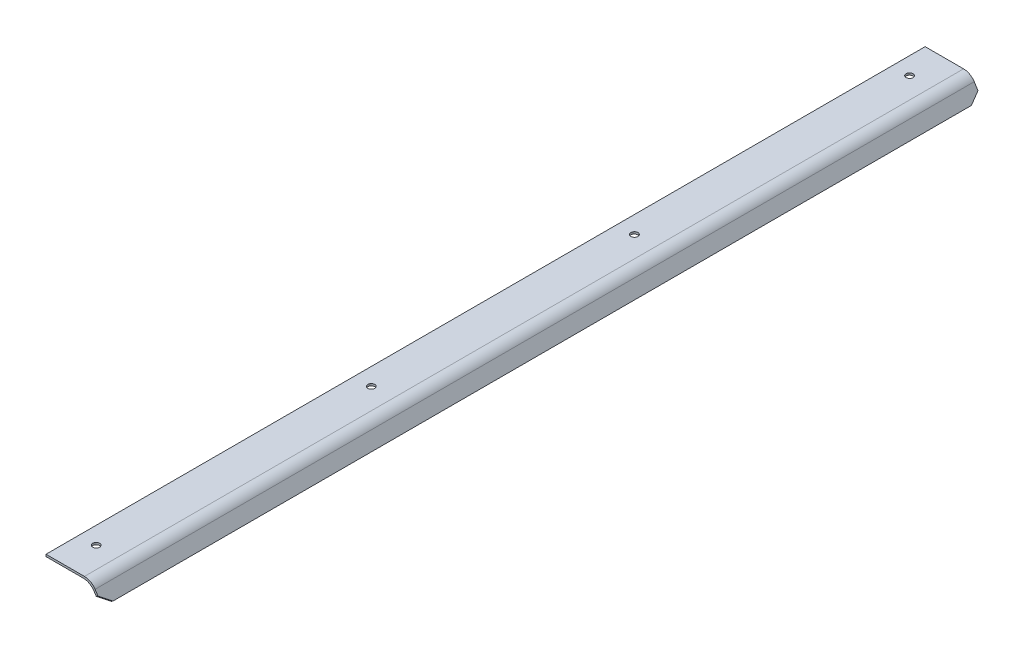
ISO-10303-21;
HEADER;
FILE_DESCRIPTION(('STEP AP214'),'2;1');
FILE_NAME('part.step','',(''),(''),'','','');
FILE_SCHEMA(('AUTOMOTIVE_DESIGN { 1 0 10303 214 1 1 1 1 }'));
ENDSEC;
DATA;
#1=APPLICATION_CONTEXT('core data for automotive mechanical design processes');
#2=APPLICATION_PROTOCOL_DEFINITION('international standard','automotive_design',2000,#1);
#3=PRODUCT_CONTEXT('',#1,'mechanical');
#4=PRODUCT('Part','Part','',(#3));
#5=PRODUCT_RELATED_PRODUCT_CATEGORY('part','',(#4));
#6=PRODUCT_DEFINITION_FORMATION('','',#4);
#7=PRODUCT_DEFINITION_CONTEXT('part definition',#1,'design');
#8=PRODUCT_DEFINITION('design','',#6,#7);
#9=PRODUCT_DEFINITION_SHAPE('','',#8);
#10=(LENGTH_UNIT() NAMED_UNIT(*) SI_UNIT(.MILLI.,.METRE.));
#11=(NAMED_UNIT(*) PLANE_ANGLE_UNIT() SI_UNIT($,.RADIAN.));
#12=(NAMED_UNIT(*) SI_UNIT($,.STERADIAN.) SOLID_ANGLE_UNIT());
#13=UNCERTAINTY_MEASURE_WITH_UNIT(LENGTH_MEASURE(1.E-05),#10,'distance_accuracy_value','');
#14=(GEOMETRIC_REPRESENTATION_CONTEXT(3) GLOBAL_UNCERTAINTY_ASSIGNED_CONTEXT((#13)) GLOBAL_UNIT_ASSIGNED_CONTEXT((#10,
#11,#12)) REPRESENTATION_CONTEXT('',''));
#15=CARTESIAN_POINT('',(0.,0.,0.));
#16=DIRECTION('',(0.,0.,1.));
#17=DIRECTION('',(1.,0.,0.));
#18=AXIS2_PLACEMENT_3D('',#15,#16,#17);
#19=CARTESIAN_POINT('',(30.5402033473676,-6.72031508959953,-254.));
#20=DIRECTION('',(-0.451408434082913,0.698955018543043,0.554700196225229));
#21=DIRECTION('',(0.,-0.621639976101332,0.783303095942264));
#22=AXIS2_PLACEMENT_3D('',#19,#20,#21);
#23=PLANE('',#22);
#24=DIRECTION('',(0.840039386199942,0.542525418420947,0.));
#25=VECTOR('',#24,1.);
#26=CARTESIAN_POINT('',(32.7103050210514,-10.0804726343993,-248.));
#27=LINE('',#26,#25);
#28=CARTESIAN_POINT('',(31.7022577576114,-10.7315031365044,-248.));
#29=VERTEX_POINT('',#28);
#30=CARTESIAN_POINT('',(32.7103050210514,-10.0804726343992,-248.));
#31=VERTEX_POINT('',#30);
#32=EDGE_CURVE('E171',#29,#31,#27,.T.);
#33=ORIENTED_EDGE('',*,*,#32,.F.);
#34=DIRECTION('',(0.300938956055274,-0.465970012362026,0.832050294337846));
#35=VECTOR('',#34,1.);
#36=CARTESIAN_POINT('',(29.5321560839277,-7.37134559170467,-254.));
#37=LINE('',#36,#35);
#38=CARTESIAN_POINT('',(29.5321560839277,-7.37134559170469,-254.));
#39=VERTEX_POINT('',#38);
#40=EDGE_CURVE('E140',#39,#29,#37,.T.);
#41=ORIENTED_EDGE('',*,*,#40,.F.);
#42=DIRECTION('',(-0.840039386199941,-0.542525418420949,0.));
#43=VECTOR('',#42,1.);
#44=CARTESIAN_POINT('',(30.5402033473676,-6.72031508959953,-254.));
#45=LINE('',#44,#43);
#46=CARTESIAN_POINT('',(30.5402033473676,-6.72031508959955,-254.));
#47=VERTEX_POINT('',#46);
#48=EDGE_CURVE('E179',#47,#39,#45,.T.);
#49=ORIENTED_EDGE('',*,*,#48,.F.);
#50=DIRECTION('',(-0.300938956055274,0.465970012362026,-0.832050294337845));
#51=VECTOR('',#50,1.);
#52=CARTESIAN_POINT('',(32.7103050210514,-10.0804726343993,-248.));
#53=LINE('',#52,#51);
#54=EDGE_CURVE('E152',#31,#47,#53,.T.);
#55=ORIENTED_EDGE('',*,*,#54,.F.);
#56=EDGE_LOOP('',(#33,#41,#49,#55));
#57=FACE_BOUND('',#56,.T.);
#58=ADVANCED_FACE('F15',(#57),#23,.F.);
#59=CARTESIAN_POINT('',(32.7103050210514,-10.0804726343993,0.));
#60=DIRECTION('',(0.542525418420947,-0.840039386199942,0.));
#61=DIRECTION('',(0.840039386199942,0.542525418420947,0.));
#62=AXIS2_PLACEMENT_3D('',#59,#60,#61);
#63=PLANE('',#62);
#64=DIRECTION('',(-0.840039386199941,-0.54252541842095,0.));
#65=VECTOR('',#64,1.);
#66=CARTESIAN_POINT('',(32.7103050210514,-10.0804726343993,248.));
#67=LINE('',#66,#65);
#68=CARTESIAN_POINT('',(32.7103050210514,-10.0804726343993,248.));
#69=VERTEX_POINT('',#68);
#70=CARTESIAN_POINT('',(31.7022577576115,-10.7315031365044,248.));
#71=VERTEX_POINT('',#70);
#72=EDGE_CURVE('E167',#69,#71,#67,.T.);
#73=ORIENTED_EDGE('',*,*,#72,.T.);
#74=DIRECTION('',(0.,0.,1.));
#75=VECTOR('',#74,1.);
#76=CARTESIAN_POINT('',(31.7022577576115,-10.7315031365044,0.));
#77=LINE('',#76,#75);
#78=EDGE_CURVE('E143',#29,#71,#77,.T.);
#79=ORIENTED_EDGE('',*,*,#78,.F.);
#80=ORIENTED_EDGE('',*,*,#32,.T.);
#81=DIRECTION('',(0.,0.,1.));
#82=VECTOR('',#81,1.);
#83=CARTESIAN_POINT('',(32.7103050210514,-10.0804726343993,0.));
#84=LINE('',#83,#82);
#85=EDGE_CURVE('E144',#69,#31,#84,.F.);
#86=ORIENTED_EDGE('',*,*,#85,.F.);
#87=EDGE_LOOP('',(#73,#79,#80,#86));
#88=FACE_BOUND('',#87,.T.);
#89=ADVANCED_FACE('F264',(#88),#63,.T.);
#90=CARTESIAN_POINT('',(32.7103050210514,-10.0804726343993,248.));
#91=DIRECTION('',(-0.418818268964526,0.648492825671256,-0.63564794708586));
#92=DIRECTION('',(0.,0.699998784175362,0.714144034598774));
#93=AXIS2_PLACEMENT_3D('',#90,#91,#92);
#94=PLANE('',#93);
#95=DIRECTION('',(0.840039386199941,0.54252541842095,0.));
#96=VECTOR('',#95,1.);
#97=CARTESIAN_POINT('',(29.0219635809521,-6.58137007628866,254.));
#98=LINE('',#97,#96);
#99=CARTESIAN_POINT('',(29.0219635809522,-6.58137007628869,254.));
#100=VERTEX_POINT('',#99);
#101=CARTESIAN_POINT('',(30.0300108443921,-5.93033957418356,254.));
#102=VERTEX_POINT('',#101);
#103=EDGE_CURVE('E156',#100,#102,#98,.T.);
#104=ORIENTED_EDGE('',*,*,#103,.F.);
#105=DIRECTION('',(-0.344855168461172,0.533969311309256,0.771979071844267));
#106=VECTOR('',#105,1.);
#107=CARTESIAN_POINT('',(31.7022577576115,-10.7315031365044,248.));
#108=LINE('',#107,#106);
#109=EDGE_CURVE('E104',#71,#100,#108,.T.);
#110=ORIENTED_EDGE('',*,*,#109,.F.);
#111=ORIENTED_EDGE('',*,*,#72,.F.);
#112=DIRECTION('',(0.344855168461172,-0.533969311309256,-0.771979071844267));
#113=VECTOR('',#112,1.);
#114=CARTESIAN_POINT('',(30.0300108443921,-5.93033957418355,254.));
#115=LINE('',#114,#113);
#116=EDGE_CURVE('E155',#102,#69,#115,.T.);
#117=ORIENTED_EDGE('',*,*,#116,.F.);
#118=EDGE_LOOP('',(#104,#110,#111,#117));
#119=FACE_BOUND('',#118,.T.);
#120=ADVANCED_FACE('F266',(#119),#94,.F.);
#121=CARTESIAN_POINT('',(28.3701016736838,-3.36015754479977,0.));
#122=DIRECTION('',(0.840039386199941,0.542525418420949,0.));
#123=DIRECTION('',(-0.542525418420949,0.840039386199941,0.));
#124=AXIS2_PLACEMENT_3D('',#121,#122,#123);
#125=PLANE('',#124);
#126=ORIENTED_EDGE('',*,*,#116,.T.);
#127=ORIENTED_EDGE('',*,*,#85,.T.);
#128=ORIENTED_EDGE('',*,*,#54,.T.);
#129=DIRECTION('',(-0.542525418420949,0.840039386199941,0.));
#130=VECTOR('',#129,1.);
#131=CARTESIAN_POINT('',(30.5402033473676,-6.72031508959953,-254.));
#132=LINE('',#131,#130);
#133=CARTESIAN_POINT('',(28.3701016736838,-3.36015754479977,-254.));
#134=VERTEX_POINT('',#133);
#135=EDGE_CURVE('E151',#47,#134,#132,.T.);
#136=ORIENTED_EDGE('',*,*,#135,.T.);
#137=DIRECTION('',(0.,0.,1.));
#138=VECTOR('',#137,1.);
#139=CARTESIAN_POINT('',(28.3701016736838,-3.36015754479977,0.));
#140=LINE('',#139,#138);
#141=CARTESIAN_POINT('',(28.3701016736838,-3.36015754479977,254.));
#142=VERTEX_POINT('',#141);
#143=EDGE_CURVE('E148',#142,#134,#140,.F.);
#144=ORIENTED_EDGE('',*,*,#143,.F.);
#145=DIRECTION('',(-0.542525418420949,0.840039386199941,0.));
#146=VECTOR('',#145,1.);
#147=CARTESIAN_POINT('',(30.0300108443921,-5.93033957418355,254.));
#148=LINE('',#147,#146);
#149=EDGE_CURVE('E118',#102,#142,#148,.T.);
#150=ORIENTED_EDGE('',*,*,#149,.F.);
#151=EDGE_LOOP('',(#126,#127,#128,#136,#144,#150));
#152=FACE_BOUND('',#151,.T.);
#153=ADVANCED_FACE('F225',(#152),#125,.T.);
#154=CARTESIAN_POINT('',(21.5464955251941,-8.54501473983891,0.));
#155=DIRECTION('',(0.,0.,1.));
#156=DIRECTION('',(1.,0.,0.));
#157=AXIS2_PLACEMENT_3D('',#154,#155,#156);
#158=CYLINDRICAL_SURFACE('',#157,7.34501473983891);
#159=DIRECTION('',(0.,0.,-1.));
#160=VECTOR('',#159,1.);
#161=CARTESIAN_POINT('',(21.5464955251941,-1.2,0.));
#162=LINE('',#161,#160);
#163=CARTESIAN_POINT('',(21.5464955251941,-1.2,-254.));
#164=VERTEX_POINT('',#163);
#165=CARTESIAN_POINT('',(21.5464955251941,-1.2,254.));
#166=VERTEX_POINT('',#165);
#167=EDGE_CURVE('E89',#164,#166,#162,.F.);
#168=ORIENTED_EDGE('',*,*,#167,.F.);
#169=CARTESIAN_POINT('',(21.5464955251941,-8.54501473983891,-254.));
#170=DIRECTION('',(0.,0.,1.));
#171=DIRECTION('',(1.,0.,0.));
#172=AXIS2_PLACEMENT_3D('',#169,#170,#171);
#173=CIRCLE('',#172,7.34501473983891);
#174=CARTESIAN_POINT('',(27.7165971988779,-4.56015754479976,-254.));
#175=VERTEX_POINT('',#174);
#176=EDGE_CURVE('E100',#164,#175,#173,.F.);
#177=ORIENTED_EDGE('',*,*,#176,.T.);
#178=DIRECTION('',(0.,0.,1.));
#179=VECTOR('',#178,1.);
#180=CARTESIAN_POINT('',(27.7165971988779,-4.56015754479976,0.));
#181=LINE('',#180,#179);
#182=CARTESIAN_POINT('',(27.7165971988779,-4.56015754479976,254.));
#183=VERTEX_POINT('',#182);
#184=EDGE_CURVE('E94',#183,#175,#181,.F.);
#185=ORIENTED_EDGE('',*,*,#184,.F.);
#186=CARTESIAN_POINT('',(21.5464955251941,-8.54501473983891,254.));
#187=DIRECTION('',(0.,0.,1.));
#188=DIRECTION('',(1.,0.,0.));
#189=AXIS2_PLACEMENT_3D('',#186,#187,#188);
#190=CIRCLE('',#189,7.34501473983891);
#191=EDGE_CURVE('E19',#166,#183,#190,.F.);
#192=ORIENTED_EDGE('',*,*,#191,.F.);
#193=EDGE_LOOP('',(#168,#177,#185,#192));
#194=FACE_BOUND('',#193,.T.);
#195=ADVANCED_FACE('F96',(#194),#158,.F.);
#196=CARTESIAN_POINT('',(31.7022577576115,-10.7315031365044,0.));
#197=DIRECTION('',(-0.840039386199941,-0.542525418420949,0.));
#198=DIRECTION('',(0.542525418420949,-0.840039386199941,0.));
#199=AXIS2_PLACEMENT_3D('',#196,#197,#198);
#200=PLANE('',#199);
#201=ORIENTED_EDGE('',*,*,#184,.T.);
#202=DIRECTION('',(0.54252541842095,-0.840039386199941,0.));
#203=VECTOR('',#202,1.);
#204=CARTESIAN_POINT('',(27.7165971988779,-4.56015754479976,-254.));
#205=LINE('',#204,#203);
#206=EDGE_CURVE('E131',#175,#39,#205,.T.);
#207=ORIENTED_EDGE('',*,*,#206,.T.);
#208=ORIENTED_EDGE('',*,*,#40,.T.);
#209=ORIENTED_EDGE('',*,*,#78,.T.);
#210=ORIENTED_EDGE('',*,*,#109,.T.);
#211=DIRECTION('',(0.54252541842095,-0.840039386199941,0.));
#212=VECTOR('',#211,1.);
#213=CARTESIAN_POINT('',(27.7165971988779,-4.56015754479976,254.));
#214=LINE('',#213,#212);
#215=EDGE_CURVE('E108',#183,#100,#214,.T.);
#216=ORIENTED_EDGE('',*,*,#215,.F.);
#217=EDGE_LOOP('',(#201,#207,#208,#209,#210,#216));
#218=FACE_BOUND('',#217,.T.);
#219=ADVANCED_FACE('F109',(#218),#200,.T.);
#220=CARTESIAN_POINT('',(21.5464955251941,-1.2,0.));
#221=DIRECTION('',(0.,-1.,0.));
#222=DIRECTION('',(0.,0.,-1.));
#223=AXIS2_PLACEMENT_3D('',#220,#221,#222);
#224=PLANE('',#223);
#225=CARTESIAN_POINT('',(10.,-1.2,-235.));
#226=DIRECTION('',(0.,-1.,0.));
#227=DIRECTION('',(0.,0.,-1.));
#228=AXIS2_PLACEMENT_3D('',#225,#226,#227);
#229=CIRCLE('',#228,1.99999999999999);
#230=CARTESIAN_POINT('',(10.,-1.2,-237.));
#231=VERTEX_POINT('',#230);
#232=EDGE_CURVE('E198',#231,#231,#229,.F.);
#233=ORIENTED_EDGE('',*,*,#232,.T.);
#234=EDGE_LOOP('',(#233));
#235=FACE_BOUND('',#234,.T.);
#236=CARTESIAN_POINT('',(10.,-1.2,-76.0000000000001));
#237=DIRECTION('',(0.,-1.,0.));
#238=DIRECTION('',(0.,0.,-1.));
#239=AXIS2_PLACEMENT_3D('',#236,#237,#238);
#240=CIRCLE('',#239,2.00000000000001);
#241=CARTESIAN_POINT('',(10.,-1.2,-78.0000000000001));
#242=VERTEX_POINT('',#241);
#243=EDGE_CURVE('E202',#242,#242,#240,.F.);
#244=ORIENTED_EDGE('',*,*,#243,.T.);
#245=EDGE_LOOP('',(#244));
#246=FACE_BOUND('',#245,.T.);
#247=CARTESIAN_POINT('',(10.,-1.2,76.0000000000001));
#248=DIRECTION('',(0.,-1.,0.));
#249=DIRECTION('',(0.,0.,-1.));
#250=AXIS2_PLACEMENT_3D('',#247,#248,#249);
#251=CIRCLE('',#250,2.);
#252=CARTESIAN_POINT('',(10.,-1.2,74.0000000000001));
#253=VERTEX_POINT('',#252);
#254=EDGE_CURVE('E205',#253,#253,#251,.F.);
#255=ORIENTED_EDGE('',*,*,#254,.T.);
#256=EDGE_LOOP('',(#255));
#257=FACE_BOUND('',#256,.T.);
#258=CARTESIAN_POINT('',(10.0000000000001,-1.2,235.));
#259=DIRECTION('',(0.,-1.,0.));
#260=DIRECTION('',(0.,0.,-1.));
#261=AXIS2_PLACEMENT_3D('',#258,#259,#260);
#262=CIRCLE('',#261,2.00000000000005);
#263=CARTESIAN_POINT('',(10.0000000000001,-1.2,233.));
#264=VERTEX_POINT('',#263);
#265=EDGE_CURVE('E137',#264,#264,#262,.F.);
#266=ORIENTED_EDGE('',*,*,#265,.T.);
#267=EDGE_LOOP('',(#266));
#268=FACE_BOUND('',#267,.T.);
#269=DIRECTION('',(1.,0.,0.));
#270=VECTOR('',#269,1.);
#271=CARTESIAN_POINT('',(17.7188784915813,-1.2,-254.));
#272=LINE('',#271,#270);
#273=CARTESIAN_POINT('',(0.,-1.2,-254.));
#274=VERTEX_POINT('',#273);
#275=EDGE_CURVE('E211',#274,#164,#272,.T.);
#276=ORIENTED_EDGE('',*,*,#275,.T.);
#277=ORIENTED_EDGE('',*,*,#167,.T.);
#278=DIRECTION('',(1.,0.,0.));
#279=VECTOR('',#278,1.);
#280=CARTESIAN_POINT('',(17.7188784915813,-1.2,254.));
#281=LINE('',#280,#279);
#282=CARTESIAN_POINT('',(0.,-1.2,254.));
#283=VERTEX_POINT('',#282);
#284=EDGE_CURVE('E117',#283,#166,#281,.T.);
#285=ORIENTED_EDGE('',*,*,#284,.F.);
#286=DIRECTION('',(0.,0.,1.));
#287=VECTOR('',#286,1.);
#288=CARTESIAN_POINT('',(0.,-1.2,0.));
#289=LINE('',#288,#287);
#290=EDGE_CURVE('E134',#274,#283,#289,.T.);
#291=ORIENTED_EDGE('',*,*,#290,.F.);
#292=EDGE_LOOP('',(#276,#277,#285,#291));
#293=FACE_BOUND('',#292,.T.);
#294=ADVANCED_FACE('F254',(#235,#246,#257,#268,#293),#224,.T.);
#295=CARTESIAN_POINT('',(17.7188784915813,-2.3051456712072,254.));
#296=DIRECTION('',(0.,0.,1.));
#297=DIRECTION('',(1.,0.,0.));
#298=AXIS2_PLACEMENT_3D('',#295,#296,#297);
#299=PLANE('',#298);
#300=ORIENTED_EDGE('',*,*,#191,.T.);
#301=ORIENTED_EDGE('',*,*,#215,.T.);
#302=ORIENTED_EDGE('',*,*,#103,.T.);
#303=ORIENTED_EDGE('',*,*,#149,.T.);
#304=CARTESIAN_POINT('',(22.2,-7.34501473983891,254.));
#305=DIRECTION('',(0.,0.,1.));
#306=DIRECTION('',(1.,0.,0.));
#307=AXIS2_PLACEMENT_3D('',#304,#305,#306);
#308=CIRCLE('',#307,7.34501473983891);
#309=CARTESIAN_POINT('',(22.2,0.,254.));
#310=VERTEX_POINT('',#309);
#311=EDGE_CURVE('E113',#310,#142,#308,.F.);
#312=ORIENTED_EDGE('',*,*,#311,.F.);
#313=DIRECTION('',(1.,0.,0.));
#314=VECTOR('',#313,1.);
#315=CARTESIAN_POINT('',(0.,0.,254.));
#316=LINE('',#315,#314);
#317=CARTESIAN_POINT('',(0.,0.,254.));
#318=VERTEX_POINT('',#317);
#319=EDGE_CURVE('E201',#318,#310,#316,.T.);
#320=ORIENTED_EDGE('',*,*,#319,.F.);
#321=DIRECTION('',(0.,1.,0.));
#322=VECTOR('',#321,1.);
#323=CARTESIAN_POINT('',(0.,-1.2,254.));
#324=LINE('',#323,#322);
#325=EDGE_CURVE('E128',#283,#318,#324,.T.);
#326=ORIENTED_EDGE('',*,*,#325,.F.);
#327=ORIENTED_EDGE('',*,*,#284,.T.);
#328=EDGE_LOOP('',(#300,#301,#302,#303,#312,#320,#326,#327));
#329=FACE_BOUND('',#328,.T.);
#330=ADVANCED_FACE('F115',(#329),#299,.T.);
#331=CARTESIAN_POINT('',(22.2,-7.34501473983891,0.));
#332=DIRECTION('',(0.,0.,1.));
#333=DIRECTION('',(1.,0.,0.));
#334=AXIS2_PLACEMENT_3D('',#331,#332,#333);
#335=CYLINDRICAL_SURFACE('',#334,7.34501473983891);
#336=CARTESIAN_POINT('',(22.2,-7.34501473983891,-254.));
#337=DIRECTION('',(0.,0.,1.));
#338=DIRECTION('',(1.,0.,0.));
#339=AXIS2_PLACEMENT_3D('',#336,#337,#338);
#340=CIRCLE('',#339,7.34501473983891);
#341=CARTESIAN_POINT('',(22.2,0.,-254.));
#342=VERTEX_POINT('',#341);
#343=EDGE_CURVE('E212',#134,#342,#340,.T.);
#344=ORIENTED_EDGE('',*,*,#343,.T.);
#345=DIRECTION('',(0.,0.,1.));
#346=VECTOR('',#345,1.);
#347=CARTESIAN_POINT('',(22.2,0.,0.));
#348=LINE('',#347,#346);
#349=EDGE_CURVE('E220',#310,#342,#348,.F.);
#350=ORIENTED_EDGE('',*,*,#349,.F.);
#351=ORIENTED_EDGE('',*,*,#311,.T.);
#352=ORIENTED_EDGE('',*,*,#143,.T.);
#353=EDGE_LOOP('',(#344,#350,#351,#352));
#354=FACE_BOUND('',#353,.T.);
#355=ADVANCED_FACE('F216',(#354),#335,.T.);
#356=CARTESIAN_POINT('',(17.7188784915813,-2.3051456712072,-254.));
#357=DIRECTION('',(0.,0.,1.));
#358=DIRECTION('',(1.,0.,0.));
#359=AXIS2_PLACEMENT_3D('',#356,#357,#358);
#360=PLANE('',#359);
#361=ORIENTED_EDGE('',*,*,#206,.F.);
#362=ORIENTED_EDGE('',*,*,#176,.F.);
#363=ORIENTED_EDGE('',*,*,#275,.F.);
#364=DIRECTION('',(0.,1.,0.));
#365=VECTOR('',#364,1.);
#366=CARTESIAN_POINT('',(0.,-1.2,-254.));
#367=LINE('',#366,#365);
#368=CARTESIAN_POINT('',(0.,0.,-254.));
#369=VERTEX_POINT('',#368);
#370=EDGE_CURVE('E34',#369,#274,#367,.F.);
#371=ORIENTED_EDGE('',*,*,#370,.F.);
#372=DIRECTION('',(1.,0.,0.));
#373=VECTOR('',#372,1.);
#374=CARTESIAN_POINT('',(0.,0.,-254.));
#375=LINE('',#374,#373);
#376=EDGE_CURVE('E235',#342,#369,#375,.F.);
#377=ORIENTED_EDGE('',*,*,#376,.F.);
#378=ORIENTED_EDGE('',*,*,#343,.F.);
#379=ORIENTED_EDGE('',*,*,#135,.F.);
#380=ORIENTED_EDGE('',*,*,#48,.T.);
#381=EDGE_LOOP('',(#361,#362,#363,#371,#377,#378,#379,#380));
#382=FACE_BOUND('',#381,.T.);
#383=ADVANCED_FACE('F255',(#382),#360,.F.);
#384=CARTESIAN_POINT('',(0.,-1.2,0.));
#385=DIRECTION('',(-1.,0.,0.));
#386=DIRECTION('',(0.,0.,1.));
#387=AXIS2_PLACEMENT_3D('',#384,#385,#386);
#388=PLANE('',#387);
#389=ORIENTED_EDGE('',*,*,#370,.T.);
#390=ORIENTED_EDGE('',*,*,#290,.T.);
#391=ORIENTED_EDGE('',*,*,#325,.T.);
#392=DIRECTION('',(0.,0.,1.));
#393=VECTOR('',#392,1.);
#394=CARTESIAN_POINT('',(0.,0.,0.));
#395=LINE('',#394,#393);
#396=EDGE_CURVE('E197',#369,#318,#395,.T.);
#397=ORIENTED_EDGE('',*,*,#396,.F.);
#398=EDGE_LOOP('',(#389,#390,#391,#397));
#399=FACE_BOUND('',#398,.T.);
#400=ADVANCED_FACE('F252',(#399),#388,.T.);
#401=CARTESIAN_POINT('',(10.0000000000001,0.,235.));
#402=DIRECTION('',(0.,-1.,0.));
#403=DIRECTION('',(0.,0.,-1.));
#404=AXIS2_PLACEMENT_3D('',#401,#402,#403);
#405=CYLINDRICAL_SURFACE('',#404,2.00000000000005);
#406=CARTESIAN_POINT('',(10.0000000000001,0.,235.));
#407=DIRECTION('',(0.,-1.,0.));
#408=DIRECTION('',(0.,0.,-1.));
#409=AXIS2_PLACEMENT_3D('',#406,#407,#408);
#410=CIRCLE('',#409,2.00000000000005);
#411=CARTESIAN_POINT('',(10.0000000000001,0.,233.));
#412=VERTEX_POINT('',#411);
#413=EDGE_CURVE('E194',#412,#412,#410,.T.);
#414=ORIENTED_EDGE('',*,*,#413,.F.);
#415=EDGE_LOOP('',(#414));
#416=FACE_BOUND('',#415,.T.);
#417=ORIENTED_EDGE('',*,*,#265,.F.);
#418=EDGE_LOOP('',(#417));
#419=FACE_BOUND('',#418,.T.);
#420=ADVANCED_FACE('F288',(#416,#419),#405,.F.);
#421=CARTESIAN_POINT('',(10.,0.,76.0000000000001));
#422=DIRECTION('',(0.,-1.,0.));
#423=DIRECTION('',(0.,0.,-1.));
#424=AXIS2_PLACEMENT_3D('',#421,#422,#423);
#425=CYLINDRICAL_SURFACE('',#424,2.);
#426=CARTESIAN_POINT('',(10.,0.,76.0000000000001));
#427=DIRECTION('',(0.,-1.,0.));
#428=DIRECTION('',(0.,0.,-1.));
#429=AXIS2_PLACEMENT_3D('',#426,#427,#428);
#430=CIRCLE('',#429,2.);
#431=CARTESIAN_POINT('',(10.,0.,74.0000000000001));
#432=VERTEX_POINT('',#431);
#433=EDGE_CURVE('E191',#432,#432,#430,.T.);
#434=ORIENTED_EDGE('',*,*,#433,.F.);
#435=EDGE_LOOP('',(#434));
#436=FACE_BOUND('',#435,.T.);
#437=ORIENTED_EDGE('',*,*,#254,.F.);
#438=EDGE_LOOP('',(#437));
#439=FACE_BOUND('',#438,.T.);
#440=ADVANCED_FACE('F338',(#436,#439),#425,.F.);
#441=CARTESIAN_POINT('',(10.,0.,-76.0000000000001));
#442=DIRECTION('',(0.,-1.,0.));
#443=DIRECTION('',(0.,0.,-1.));
#444=AXIS2_PLACEMENT_3D('',#441,#442,#443);
#445=CYLINDRICAL_SURFACE('',#444,2.00000000000001);
#446=CARTESIAN_POINT('',(10.,0.,-76.0000000000001));
#447=DIRECTION('',(0.,-1.,0.));
#448=DIRECTION('',(0.,0.,-1.));
#449=AXIS2_PLACEMENT_3D('',#446,#447,#448);
#450=CIRCLE('',#449,2.00000000000001);
#451=CARTESIAN_POINT('',(10.,0.,-78.0000000000001));
#452=VERTEX_POINT('',#451);
#453=EDGE_CURVE('E25',#452,#452,#450,.T.);
#454=ORIENTED_EDGE('',*,*,#453,.F.);
#455=EDGE_LOOP('',(#454));
#456=FACE_BOUND('',#455,.T.);
#457=ORIENTED_EDGE('',*,*,#243,.F.);
#458=EDGE_LOOP('',(#457));
#459=FACE_BOUND('',#458,.T.);
#460=ADVANCED_FACE('F282',(#456,#459),#445,.F.);
#461=CARTESIAN_POINT('',(10.,0.,-235.));
#462=DIRECTION('',(0.,-1.,0.));
#463=DIRECTION('',(0.,0.,-1.));
#464=AXIS2_PLACEMENT_3D('',#461,#462,#463);
#465=CYLINDRICAL_SURFACE('',#464,1.99999999999999);
#466=CARTESIAN_POINT('',(10.,0.,-235.));
#467=DIRECTION('',(0.,-1.,0.));
#468=DIRECTION('',(0.,0.,-1.));
#469=AXIS2_PLACEMENT_3D('',#466,#467,#468);
#470=CIRCLE('',#469,1.99999999999999);
#471=CARTESIAN_POINT('',(10.,0.,-237.));
#472=VERTEX_POINT('',#471);
#473=EDGE_CURVE('E9',#472,#472,#470,.T.);
#474=ORIENTED_EDGE('',*,*,#473,.F.);
#475=EDGE_LOOP('',(#474));
#476=FACE_BOUND('',#475,.T.);
#477=ORIENTED_EDGE('',*,*,#232,.F.);
#478=EDGE_LOOP('',(#477));
#479=FACE_BOUND('',#478,.T.);
#480=ADVANCED_FACE('F17',(#476,#479),#465,.F.);
#481=CARTESIAN_POINT('',(0.,0.,0.));
#482=DIRECTION('',(0.,1.,0.));
#483=DIRECTION('',(0.,0.,1.));
#484=AXIS2_PLACEMENT_3D('',#481,#482,#483);
#485=PLANE('',#484);
#486=ORIENTED_EDGE('',*,*,#473,.T.);
#487=EDGE_LOOP('',(#486));
#488=FACE_BOUND('',#487,.T.);
#489=ORIENTED_EDGE('',*,*,#453,.T.);
#490=EDGE_LOOP('',(#489));
#491=FACE_BOUND('',#490,.T.);
#492=ORIENTED_EDGE('',*,*,#433,.T.);
#493=EDGE_LOOP('',(#492));
#494=FACE_BOUND('',#493,.T.);
#495=ORIENTED_EDGE('',*,*,#413,.T.);
#496=EDGE_LOOP('',(#495));
#497=FACE_BOUND('',#496,.T.);
#498=ORIENTED_EDGE('',*,*,#376,.T.);
#499=ORIENTED_EDGE('',*,*,#396,.T.);
#500=ORIENTED_EDGE('',*,*,#319,.T.);
#501=ORIENTED_EDGE('',*,*,#349,.T.);
#502=EDGE_LOOP('',(#498,#499,#500,#501));
#503=FACE_BOUND('',#502,.T.);
#504=ADVANCED_FACE('F250',(#488,#491,#494,#497,#503),#485,.T.);
#505=CLOSED_SHELL('',(#58,#89,#120,#153,#195,#219,#294,#330,#355,#383,#400,#420,#440,#460,#480,#504));
#506=MANIFOLD_SOLID_BREP('B1',#505);
#507=ADVANCED_BREP_SHAPE_REPRESENTATION('',(#18,#506),#14);
#508=SHAPE_DEFINITION_REPRESENTATION(#9,#507);
ENDSEC;
END-ISO-10303-21;
